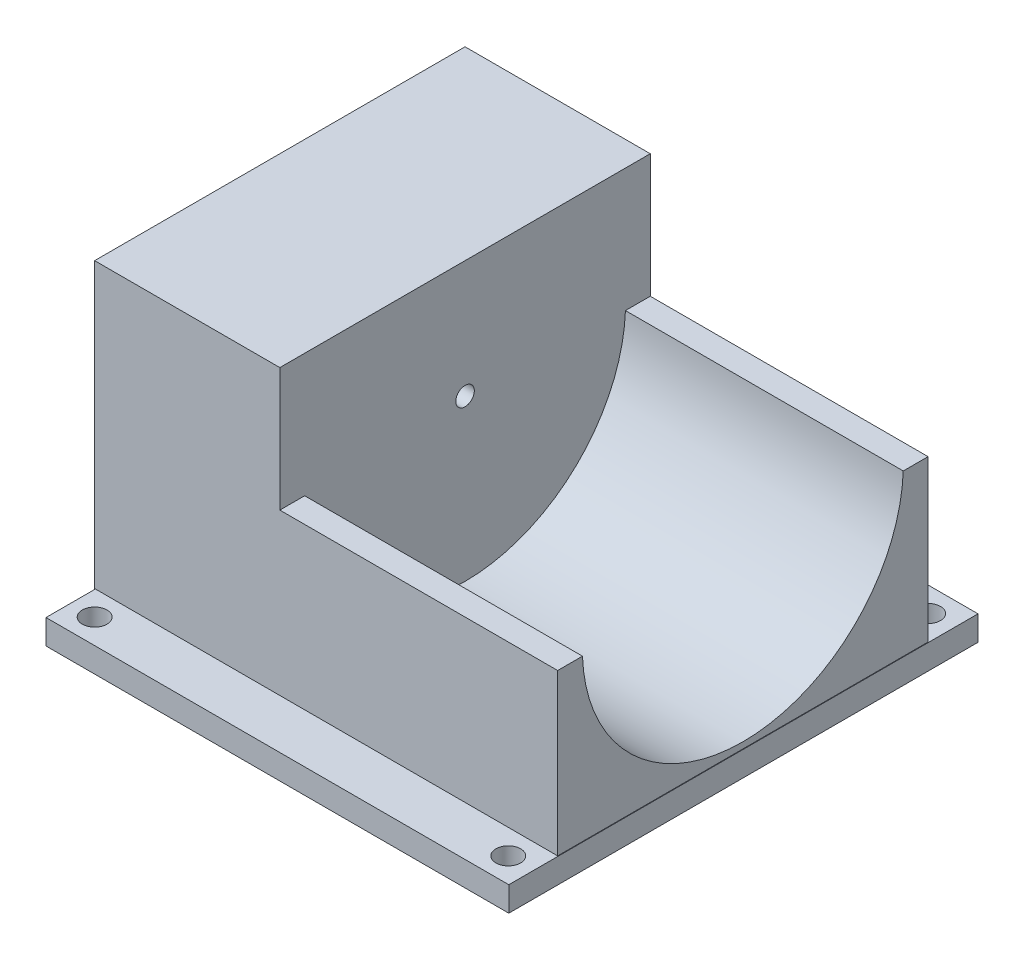
ISO-10303-21;
HEADER;
FILE_DESCRIPTION(('STEP AP214'),'2;1');
FILE_NAME('part.step','',(''),(''),'','','');
FILE_SCHEMA(('AUTOMOTIVE_DESIGN { 1 0 10303 214 1 1 1 1 }'));
ENDSEC;
DATA;
#1=APPLICATION_CONTEXT('core data for automotive mechanical design processes');
#2=APPLICATION_PROTOCOL_DEFINITION('international standard','automotive_design',2000,#1);
#3=PRODUCT_CONTEXT('',#1,'mechanical');
#4=PRODUCT('Part','Part','',(#3));
#5=PRODUCT_RELATED_PRODUCT_CATEGORY('part','',(#4));
#6=PRODUCT_DEFINITION_FORMATION('','',#4);
#7=PRODUCT_DEFINITION_CONTEXT('part definition',#1,'design');
#8=PRODUCT_DEFINITION('design','',#6,#7);
#9=PRODUCT_DEFINITION_SHAPE('','',#8);
#10=(LENGTH_UNIT() NAMED_UNIT(*) SI_UNIT(.MILLI.,.METRE.));
#11=(NAMED_UNIT(*) PLANE_ANGLE_UNIT() SI_UNIT($,.RADIAN.));
#12=(NAMED_UNIT(*) SI_UNIT($,.STERADIAN.) SOLID_ANGLE_UNIT());
#13=UNCERTAINTY_MEASURE_WITH_UNIT(LENGTH_MEASURE(1.E-05),#10,'distance_accuracy_value','');
#14=(GEOMETRIC_REPRESENTATION_CONTEXT(3) GLOBAL_UNCERTAINTY_ASSIGNED_CONTEXT((#13)) GLOBAL_UNIT_ASSIGNED_CONTEXT((#10,
#11,#12)) REPRESENTATION_CONTEXT('',''));
#15=CARTESIAN_POINT('',(0.,0.,0.));
#16=DIRECTION('',(0.,0.,1.));
#17=DIRECTION('',(1.,0.,0.));
#18=AXIS2_PLACEMENT_3D('',#15,#16,#17);
#19=CARTESIAN_POINT('',(60.,31.,0.));
#20=DIRECTION('',(1.,0.,0.));
#21=DIRECTION('',(0.,0.,-1.));
#22=AXIS2_PLACEMENT_3D('',#19,#20,#21);
#23=PLANE('',#22);
#24=DIRECTION('',(0.,-1.,0.));
#25=VECTOR('',#24,1.);
#26=CARTESIAN_POINT('',(60.,30.0067820848976,30.));
#27=LINE('',#26,#25);
#28=CARTESIAN_POINT('',(60.,30.0067820848976,30.));
#29=VERTEX_POINT('',#28);
#30=CARTESIAN_POINT('',(60.,4.00000000000001,30.));
#31=VERTEX_POINT('',#30);
#32=EDGE_CURVE('E234',#29,#31,#27,.T.);
#33=ORIENTED_EDGE('',*,*,#32,.T.);
#34=DIRECTION('',(0.,0.,-1.));
#35=VECTOR('',#34,1.);
#36=CARTESIAN_POINT('',(60.,4.,0.));
#37=LINE('',#36,#35);
#38=CARTESIAN_POINT('',(60.,4.,-30.));
#39=VERTEX_POINT('',#38);
#40=EDGE_CURVE('E12',#31,#39,#37,.T.);
#41=ORIENTED_EDGE('',*,*,#40,.T.);
#42=DIRECTION('',(0.,1.,0.));
#43=VECTOR('',#42,1.);
#44=CARTESIAN_POINT('',(60.,0.,-30.));
#45=LINE('',#44,#43);
#46=CARTESIAN_POINT('',(60.,30.0067820848976,-30.));
#47=VERTEX_POINT('',#46);
#48=EDGE_CURVE('E238',#39,#47,#45,.T.);
#49=ORIENTED_EDGE('',*,*,#48,.T.);
#50=DIRECTION('',(0.,0.,1.));
#51=VECTOR('',#50,1.);
#52=CARTESIAN_POINT('',(60.,30.0067820848976,-30.));
#53=LINE('',#52,#51);
#54=CARTESIAN_POINT('',(60.,30.0067820848976,-25.9810222695936));
#55=VERTEX_POINT('',#54);
#56=EDGE_CURVE('E241',#47,#55,#53,.T.);
#57=ORIENTED_EDGE('',*,*,#56,.T.);
#58=CARTESIAN_POINT('',(60.,31.,0.));
#59=DIRECTION('',(-1.,0.,0.));
#60=DIRECTION('',(0.,0.,-1.));
#61=AXIS2_PLACEMENT_3D('',#58,#59,#60);
#62=CIRCLE('',#61,26.);
#63=CARTESIAN_POINT('',(60.,30.0067820848976,25.9810222695936));
#64=VERTEX_POINT('',#63);
#65=EDGE_CURVE('E226',#55,#64,#62,.T.);
#66=ORIENTED_EDGE('',*,*,#65,.T.);
#67=DIRECTION('',(0.,0.,1.));
#68=VECTOR('',#67,1.);
#69=CARTESIAN_POINT('',(60.,30.0067820848976,25.9810222695936));
#70=LINE('',#69,#68);
#71=EDGE_CURVE('E230',#64,#29,#70,.T.);
#72=ORIENTED_EDGE('',*,*,#71,.T.);
#73=EDGE_LOOP('',(#33,#41,#49,#57,#66,#72));
#74=FACE_BOUND('',#73,.T.);
#75=ADVANCED_FACE('F52',(#74),#23,.T.);
#76=CARTESIAN_POINT('',(15.,50.,30.));
#77=DIRECTION('',(-1.,0.,0.));
#78=DIRECTION('',(0.,0.,1.));
#79=AXIS2_PLACEMENT_3D('',#76,#77,#78);
#80=PLANE('',#79);
#81=CARTESIAN_POINT('',(15.,31.,0.));
#82=DIRECTION('',(1.,0.,0.));
#83=DIRECTION('',(0.,0.,-1.));
#84=AXIS2_PLACEMENT_3D('',#81,#82,#83);
#85=CIRCLE('',#84,1.5);
#86=CARTESIAN_POINT('',(15.,31.,-1.5));
#87=VERTEX_POINT('',#86);
#88=EDGE_CURVE('E362',#87,#87,#85,.T.);
#89=ORIENTED_EDGE('',*,*,#88,.F.);
#90=EDGE_LOOP('',(#89));
#91=FACE_BOUND('',#90,.T.);
#92=DIRECTION('',(0.,0.,1.));
#93=VECTOR('',#92,1.);
#94=CARTESIAN_POINT('',(15.,30.0067820848976,-30.));
#95=LINE('',#94,#93);
#96=CARTESIAN_POINT('',(15.,30.0067820848976,-30.));
#97=VERTEX_POINT('',#96);
#98=CARTESIAN_POINT('',(15.,30.0067820848976,-25.9810222695936));
#99=VERTEX_POINT('',#98);
#100=EDGE_CURVE('E231',#97,#99,#95,.T.);
#101=ORIENTED_EDGE('',*,*,#100,.F.);
#102=DIRECTION('',(0.,-1.,0.));
#103=VECTOR('',#102,1.);
#104=CARTESIAN_POINT('',(15.,50.,-30.));
#105=LINE('',#104,#103);
#106=CARTESIAN_POINT('',(15.,50.,-30.));
#107=VERTEX_POINT('',#106);
#108=EDGE_CURVE('E297',#107,#97,#105,.T.);
#109=ORIENTED_EDGE('',*,*,#108,.F.);
#110=DIRECTION('',(0.,0.,-1.));
#111=VECTOR('',#110,1.);
#112=CARTESIAN_POINT('',(15.,50.,30.));
#113=LINE('',#112,#111);
#114=CARTESIAN_POINT('',(15.,50.,30.));
#115=VERTEX_POINT('',#114);
#116=EDGE_CURVE('E279',#115,#107,#113,.T.);
#117=ORIENTED_EDGE('',*,*,#116,.F.);
#118=DIRECTION('',(0.,-1.,0.));
#119=VECTOR('',#118,1.);
#120=CARTESIAN_POINT('',(15.,50.,30.));
#121=LINE('',#120,#119);
#122=CARTESIAN_POINT('',(15.,30.0067820848976,30.));
#123=VERTEX_POINT('',#122);
#124=EDGE_CURVE('E301',#115,#123,#121,.T.);
#125=ORIENTED_EDGE('',*,*,#124,.T.);
#126=DIRECTION('',(0.,0.,1.));
#127=VECTOR('',#126,1.);
#128=CARTESIAN_POINT('',(15.,30.0067820848976,25.9810222695936));
#129=LINE('',#128,#127);
#130=CARTESIAN_POINT('',(15.,30.0067820848976,25.9810222695936));
#131=VERTEX_POINT('',#130);
#132=EDGE_CURVE('E248',#131,#123,#129,.T.);
#133=ORIENTED_EDGE('',*,*,#132,.F.);
#134=CARTESIAN_POINT('',(15.,31.,0.));
#135=DIRECTION('',(-1.,0.,0.));
#136=DIRECTION('',(0.,0.,-1.));
#137=AXIS2_PLACEMENT_3D('',#134,#135,#136);
#138=CIRCLE('',#137,26.);
#139=EDGE_CURVE('E225',#99,#131,#138,.T.);
#140=ORIENTED_EDGE('',*,*,#139,.F.);
#141=EDGE_LOOP('',(#101,#109,#117,#125,#133,#140));
#142=FACE_BOUND('',#141,.T.);
#143=ADVANCED_FACE('F379',(#91,#142),#80,.F.);
#144=CARTESIAN_POINT('',(-15.,50.,30.));
#145=DIRECTION('',(1.,0.,0.));
#146=DIRECTION('',(0.,0.,-1.));
#147=AXIS2_PLACEMENT_3D('',#144,#145,#146);
#148=PLANE('',#147);
#149=DIRECTION('',(0.,0.,1.));
#150=VECTOR('',#149,1.);
#151=CARTESIAN_POINT('',(-15.,0.,30.));
#152=LINE('',#151,#150);
#153=CARTESIAN_POINT('',(-15.,0.,-30.));
#154=VERTEX_POINT('',#153);
#155=CARTESIAN_POINT('',(-15.,0.,30.));
#156=VERTEX_POINT('',#155);
#157=EDGE_CURVE('E270',#154,#156,#152,.T.);
#158=ORIENTED_EDGE('',*,*,#157,.T.);
#159=DIRECTION('',(0.,-1.,0.));
#160=VECTOR('',#159,1.);
#161=CARTESIAN_POINT('',(-15.,50.,30.));
#162=LINE('',#161,#160);
#163=CARTESIAN_POINT('',(-15.,50.,30.));
#164=VERTEX_POINT('',#163);
#165=EDGE_CURVE('E61',#164,#156,#162,.T.);
#166=ORIENTED_EDGE('',*,*,#165,.F.);
#167=DIRECTION('',(0.,0.,1.));
#168=VECTOR('',#167,1.);
#169=CARTESIAN_POINT('',(-15.,50.,30.));
#170=LINE('',#169,#168);
#171=CARTESIAN_POINT('',(-15.,50.,-30.));
#172=VERTEX_POINT('',#171);
#173=EDGE_CURVE('E271',#172,#164,#170,.T.);
#174=ORIENTED_EDGE('',*,*,#173,.F.);
#175=DIRECTION('',(0.,-1.,0.));
#176=VECTOR('',#175,1.);
#177=CARTESIAN_POINT('',(-15.,50.,-30.));
#178=LINE('',#177,#176);
#179=EDGE_CURVE('E285',#172,#154,#178,.T.);
#180=ORIENTED_EDGE('',*,*,#179,.T.);
#181=EDGE_LOOP('',(#158,#166,#174,#180));
#182=FACE_BOUND('',#181,.T.);
#183=ADVANCED_FACE('F54',(#182),#148,.F.);
#184=CARTESIAN_POINT('',(15.,50.,30.));
#185=DIRECTION('',(0.,0.,-1.));
#186=DIRECTION('',(-1.,0.,0.));
#187=AXIS2_PLACEMENT_3D('',#184,#185,#186);
#188=PLANE('',#187);
#189=DIRECTION('',(1.,0.,0.));
#190=VECTOR('',#189,1.);
#191=CARTESIAN_POINT('',(15.,0.,30.));
#192=LINE('',#191,#190);
#193=CARTESIAN_POINT('',(-14.8775471331955,0.,30.));
#194=VERTEX_POINT('',#193);
#195=EDGE_CURVE('E289',#156,#194,#192,.T.);
#196=ORIENTED_EDGE('',*,*,#195,.T.);
#197=DIRECTION('',(0.,1.,0.));
#198=VECTOR('',#197,1.);
#199=CARTESIAN_POINT('',(-14.8775471331955,50.,30.));
#200=LINE('',#199,#198);
#201=CARTESIAN_POINT('',(-14.8775471331955,4.,30.));
#202=VERTEX_POINT('',#201);
#203=EDGE_CURVE('E68',#194,#202,#200,.T.);
#204=ORIENTED_EDGE('',*,*,#203,.T.);
#205=DIRECTION('',(-1.,0.,0.));
#206=VECTOR('',#205,1.);
#207=CARTESIAN_POINT('',(15.,4.,30.));
#208=LINE('',#207,#206);
#209=EDGE_CURVE('E218',#31,#202,#208,.T.);
#210=ORIENTED_EDGE('',*,*,#209,.F.);
#211=ORIENTED_EDGE('',*,*,#32,.F.);
#212=DIRECTION('',(-1.,0.,0.));
#213=VECTOR('',#212,1.);
#214=CARTESIAN_POINT('',(60.,30.0067820848976,30.));
#215=LINE('',#214,#213);
#216=EDGE_CURVE('E262',#29,#123,#215,.T.);
#217=ORIENTED_EDGE('',*,*,#216,.T.);
#218=ORIENTED_EDGE('',*,*,#124,.F.);
#219=DIRECTION('',(1.,0.,0.));
#220=VECTOR('',#219,1.);
#221=CARTESIAN_POINT('',(15.,50.,30.));
#222=LINE('',#221,#220);
#223=EDGE_CURVE('E275',#164,#115,#222,.T.);
#224=ORIENTED_EDGE('',*,*,#223,.F.);
#225=ORIENTED_EDGE('',*,*,#165,.T.);
#226=EDGE_LOOP('',(#196,#204,#210,#211,#217,#218,#224,#225));
#227=FACE_BOUND('',#226,.T.);
#228=ADVANCED_FACE('F306',(#227),#188,.F.);
#229=CARTESIAN_POINT('',(15.,50.,-30.));
#230=DIRECTION('',(0.,0.,1.));
#231=DIRECTION('',(1.,0.,0.));
#232=AXIS2_PLACEMENT_3D('',#229,#230,#231);
#233=PLANE('',#232);
#234=DIRECTION('',(1.,0.,0.));
#235=VECTOR('',#234,1.);
#236=CARTESIAN_POINT('',(15.,4.,-30.));
#237=LINE('',#236,#235);
#238=CARTESIAN_POINT('',(-14.8775471331955,4.,-30.));
#239=VERTEX_POINT('',#238);
#240=EDGE_CURVE('E76',#239,#39,#237,.T.);
#241=ORIENTED_EDGE('',*,*,#240,.F.);
#242=DIRECTION('',(0.,-1.,0.));
#243=VECTOR('',#242,1.);
#244=CARTESIAN_POINT('',(-14.8775471331955,50.,-30.));
#245=LINE('',#244,#243);
#246=CARTESIAN_POINT('',(-14.8775471331955,0.,-30.));
#247=VERTEX_POINT('',#246);
#248=EDGE_CURVE('E160',#239,#247,#245,.T.);
#249=ORIENTED_EDGE('',*,*,#248,.T.);
#250=DIRECTION('',(-1.,0.,0.));
#251=VECTOR('',#250,1.);
#252=CARTESIAN_POINT('',(15.,0.,-30.));
#253=LINE('',#252,#251);
#254=EDGE_CURVE('E276',#247,#154,#253,.T.);
#255=ORIENTED_EDGE('',*,*,#254,.T.);
#256=ORIENTED_EDGE('',*,*,#179,.F.);
#257=DIRECTION('',(-1.,0.,0.));
#258=VECTOR('',#257,1.);
#259=CARTESIAN_POINT('',(15.,50.,-30.));
#260=LINE('',#259,#258);
#261=EDGE_CURVE('E282',#107,#172,#260,.T.);
#262=ORIENTED_EDGE('',*,*,#261,.F.);
#263=ORIENTED_EDGE('',*,*,#108,.T.);
#264=DIRECTION('',(-1.,0.,0.));
#265=VECTOR('',#264,1.);
#266=CARTESIAN_POINT('',(60.,30.0067820848976,-30.));
#267=LINE('',#266,#265);
#268=EDGE_CURVE('E258',#47,#97,#267,.T.);
#269=ORIENTED_EDGE('',*,*,#268,.F.);
#270=ORIENTED_EDGE('',*,*,#48,.F.);
#271=EDGE_LOOP('',(#241,#249,#255,#256,#262,#263,#269,#270));
#272=FACE_BOUND('',#271,.T.);
#273=ADVANCED_FACE('F389',(#272),#233,.F.);
#274=CARTESIAN_POINT('',(0.,50.,0.));
#275=DIRECTION('',(0.,1.,0.));
#276=DIRECTION('',(0.,0.,1.));
#277=AXIS2_PLACEMENT_3D('',#274,#275,#276);
#278=PLANE('',#277);
#279=ORIENTED_EDGE('',*,*,#173,.T.);
#280=ORIENTED_EDGE('',*,*,#223,.T.);
#281=ORIENTED_EDGE('',*,*,#116,.T.);
#282=ORIENTED_EDGE('',*,*,#261,.T.);
#283=EDGE_LOOP('',(#279,#280,#281,#282));
#284=FACE_BOUND('',#283,.T.);
#285=ADVANCED_FACE('F400',(#284),#278,.T.);
#286=CARTESIAN_POINT('',(0.,0.,0.));
#287=DIRECTION('',(0.,1.,0.));
#288=DIRECTION('',(0.,0.,1.));
#289=AXIS2_PLACEMENT_3D('',#286,#287,#288);
#290=PLANE('',#289);
#291=DIRECTION('',(0.,0.,-1.));
#292=VECTOR('',#291,1.);
#293=CARTESIAN_POINT('',(-14.8775471331955,0.,38.));
#294=LINE('',#293,#292);
#295=CARTESIAN_POINT('',(-14.8775471331955,0.,38.));
#296=VERTEX_POINT('',#295);
#297=EDGE_CURVE('E194',#296,#194,#294,.T.);
#298=ORIENTED_EDGE('',*,*,#297,.T.);
#299=ORIENTED_EDGE('',*,*,#195,.F.);
#300=ORIENTED_EDGE('',*,*,#157,.F.);
#301=ORIENTED_EDGE('',*,*,#254,.F.);
#302=CARTESIAN_POINT('',(-14.8775471331955,0.,-38.));
#303=VERTEX_POINT('',#302);
#304=EDGE_CURVE('E198',#247,#303,#294,.T.);
#305=ORIENTED_EDGE('',*,*,#304,.T.);
#306=DIRECTION('',(1.,0.,0.));
#307=VECTOR('',#306,1.);
#308=CARTESIAN_POINT('',(-14.8775471331955,0.,-38.));
#309=LINE('',#308,#307);
#310=CARTESIAN_POINT('',(60.0862314558118,0.,-38.));
#311=VERTEX_POINT('',#310);
#312=EDGE_CURVE('E172',#303,#311,#309,.T.);
#313=ORIENTED_EDGE('',*,*,#312,.T.);
#314=DIRECTION('',(0.,0.,1.));
#315=VECTOR('',#314,1.);
#316=CARTESIAN_POINT('',(60.0862314558117,0.,38.));
#317=LINE('',#316,#315);
#318=CARTESIAN_POINT('',(60.0862314558117,0.,38.));
#319=VERTEX_POINT('',#318);
#320=EDGE_CURVE('E201',#311,#319,#317,.T.);
#321=ORIENTED_EDGE('',*,*,#320,.T.);
#322=DIRECTION('',(-1.,0.,0.));
#323=VECTOR('',#322,1.);
#324=CARTESIAN_POINT('',(-14.8775471331955,0.,38.));
#325=LINE('',#324,#323);
#326=EDGE_CURVE('E165',#319,#296,#325,.T.);
#327=ORIENTED_EDGE('',*,*,#326,.T.);
#328=EDGE_LOOP('',(#298,#299,#300,#301,#305,#313,#321,#327));
#329=FACE_BOUND('',#328,.T.);
#330=CARTESIAN_POINT('',(-11.,0.,34.));
#331=DIRECTION('',(0.,-1.,0.));
#332=DIRECTION('',(0.,0.,-1.));
#333=AXIS2_PLACEMENT_3D('',#330,#331,#332);
#334=CIRCLE('',#333,2.);
#335=CARTESIAN_POINT('',(-11.,0.,32.));
#336=VERTEX_POINT('',#335);
#337=EDGE_CURVE('E330',#336,#336,#334,.T.);
#338=ORIENTED_EDGE('',*,*,#337,.F.);
#339=EDGE_LOOP('',(#338));
#340=FACE_BOUND('',#339,.T.);
#341=CARTESIAN_POINT('',(56.,0.,34.));
#342=DIRECTION('',(0.,-1.,0.));
#343=DIRECTION('',(0.,0.,-1.));
#344=AXIS2_PLACEMENT_3D('',#341,#342,#343);
#345=CIRCLE('',#344,2.);
#346=CARTESIAN_POINT('',(56.,0.,32.));
#347=VERTEX_POINT('',#346);
#348=EDGE_CURVE('E338',#347,#347,#345,.T.);
#349=ORIENTED_EDGE('',*,*,#348,.F.);
#350=EDGE_LOOP('',(#349));
#351=FACE_BOUND('',#350,.T.);
#352=CARTESIAN_POINT('',(56.,0.,-34.));
#353=DIRECTION('',(0.,-1.,0.));
#354=DIRECTION('',(0.,0.,-1.));
#355=AXIS2_PLACEMENT_3D('',#352,#353,#354);
#356=CIRCLE('',#355,2.);
#357=CARTESIAN_POINT('',(56.,0.,-36.));
#358=VERTEX_POINT('',#357);
#359=EDGE_CURVE('E346',#358,#358,#356,.T.);
#360=ORIENTED_EDGE('',*,*,#359,.F.);
#361=EDGE_LOOP('',(#360));
#362=FACE_BOUND('',#361,.T.);
#363=CARTESIAN_POINT('',(-11.,0.,-34.));
#364=DIRECTION('',(0.,-1.,0.));
#365=DIRECTION('',(0.,0.,-1.));
#366=AXIS2_PLACEMENT_3D('',#363,#364,#365);
#367=CIRCLE('',#366,2.);
#368=CARTESIAN_POINT('',(-11.,0.,-36.));
#369=VERTEX_POINT('',#368);
#370=EDGE_CURVE('E354',#369,#369,#367,.T.);
#371=ORIENTED_EDGE('',*,*,#370,.F.);
#372=EDGE_LOOP('',(#371));
#373=FACE_BOUND('',#372,.T.);
#374=ADVANCED_FACE('F314',(#329,#340,#351,#362,#373),#290,.F.);
#375=CARTESIAN_POINT('',(60.,31.,0.));
#376=DIRECTION('',(-1.,0.,0.));
#377=DIRECTION('',(0.,0.,1.));
#378=AXIS2_PLACEMENT_3D('',#375,#376,#377);
#379=CYLINDRICAL_SURFACE('',#378,26.);
#380=ORIENTED_EDGE('',*,*,#139,.T.);
#381=DIRECTION('',(-1.,0.,0.));
#382=VECTOR('',#381,1.);
#383=CARTESIAN_POINT('',(60.,30.0067820848976,25.9810222695936));
#384=LINE('',#383,#382);
#385=EDGE_CURVE('E266',#64,#131,#384,.T.);
#386=ORIENTED_EDGE('',*,*,#385,.F.);
#387=ORIENTED_EDGE('',*,*,#65,.F.);
#388=DIRECTION('',(-1.,0.,0.));
#389=VECTOR('',#388,1.);
#390=CARTESIAN_POINT('',(60.,30.0067820848976,-25.9810222695936));
#391=LINE('',#390,#389);
#392=EDGE_CURVE('E244',#55,#99,#391,.T.);
#393=ORIENTED_EDGE('',*,*,#392,.T.);
#394=EDGE_LOOP('',(#380,#386,#387,#393));
#395=FACE_BOUND('',#394,.T.);
#396=ADVANCED_FACE('F407',(#395),#379,.F.);
#397=CARTESIAN_POINT('',(60.,30.0067820848976,25.9810222695936));
#398=DIRECTION('',(0.,-1.,0.));
#399=DIRECTION('',(0.,0.,-1.));
#400=AXIS2_PLACEMENT_3D('',#397,#398,#399);
#401=PLANE('',#400);
#402=ORIENTED_EDGE('',*,*,#132,.T.);
#403=ORIENTED_EDGE('',*,*,#216,.F.);
#404=ORIENTED_EDGE('',*,*,#71,.F.);
#405=ORIENTED_EDGE('',*,*,#385,.T.);
#406=EDGE_LOOP('',(#402,#403,#404,#405));
#407=FACE_BOUND('',#406,.T.);
#408=ADVANCED_FACE('F398',(#407),#401,.F.);
#409=CARTESIAN_POINT('',(60.,30.0067820848976,-30.));
#410=DIRECTION('',(0.,-1.,0.));
#411=DIRECTION('',(0.,0.,-1.));
#412=AXIS2_PLACEMENT_3D('',#409,#410,#411);
#413=PLANE('',#412);
#414=ORIENTED_EDGE('',*,*,#100,.T.);
#415=ORIENTED_EDGE('',*,*,#392,.F.);
#416=ORIENTED_EDGE('',*,*,#56,.F.);
#417=ORIENTED_EDGE('',*,*,#268,.T.);
#418=EDGE_LOOP('',(#414,#415,#416,#417));
#419=FACE_BOUND('',#418,.T.);
#420=ADVANCED_FACE('F391',(#419),#413,.F.);
#421=CARTESIAN_POINT('',(-14.8775471331955,4.,38.));
#422=DIRECTION('',(-1.,0.,0.));
#423=DIRECTION('',(0.,0.,1.));
#424=AXIS2_PLACEMENT_3D('',#421,#422,#423);
#425=PLANE('',#424);
#426=ORIENTED_EDGE('',*,*,#203,.F.);
#427=ORIENTED_EDGE('',*,*,#297,.F.);
#428=DIRECTION('',(0.,-1.,0.));
#429=VECTOR('',#428,1.);
#430=CARTESIAN_POINT('',(-14.8775471331955,4.,38.));
#431=LINE('',#430,#429);
#432=CARTESIAN_POINT('',(-14.8775471331955,4.,38.));
#433=VERTEX_POINT('',#432);
#434=EDGE_CURVE('E208',#433,#296,#431,.T.);
#435=ORIENTED_EDGE('',*,*,#434,.F.);
#436=DIRECTION('',(0.,0.,-1.));
#437=VECTOR('',#436,1.);
#438=CARTESIAN_POINT('',(-14.8775471331955,4.,38.));
#439=LINE('',#438,#437);
#440=EDGE_CURVE('E164',#433,#202,#439,.T.);
#441=ORIENTED_EDGE('',*,*,#440,.T.);
#442=EDGE_LOOP('',(#426,#427,#435,#441));
#443=FACE_BOUND('',#442,.T.);
#444=ADVANCED_FACE('F319',(#443),#425,.T.);
#445=ORIENTED_EDGE('',*,*,#248,.F.);
#446=CARTESIAN_POINT('',(-14.8775471331955,4.,-38.));
#447=VERTEX_POINT('',#446);
#448=EDGE_CURVE('E154',#239,#447,#439,.T.);
#449=ORIENTED_EDGE('',*,*,#448,.T.);
#450=DIRECTION('',(0.,-1.,0.));
#451=VECTOR('',#450,1.);
#452=CARTESIAN_POINT('',(-14.8775471331955,4.,-38.));
#453=LINE('',#452,#451);
#454=EDGE_CURVE('E158',#447,#303,#453,.T.);
#455=ORIENTED_EDGE('',*,*,#454,.T.);
#456=ORIENTED_EDGE('',*,*,#304,.F.);
#457=EDGE_LOOP('',(#445,#449,#455,#456));
#458=FACE_BOUND('',#457,.T.);
#459=ADVANCED_FACE('F156',(#458),#425,.T.);
#460=CARTESIAN_POINT('',(0.,4.,0.));
#461=DIRECTION('',(0.,-1.,0.));
#462=DIRECTION('',(0.,0.,-1.));
#463=AXIS2_PLACEMENT_3D('',#460,#461,#462);
#464=PLANE('',#463);
#465=CARTESIAN_POINT('',(-11.,4.,-34.));
#466=DIRECTION('',(0.,-1.,0.));
#467=DIRECTION('',(0.,0.,-1.));
#468=AXIS2_PLACEMENT_3D('',#465,#466,#467);
#469=CIRCLE('',#468,2.);
#470=CARTESIAN_POINT('',(-11.,4.,-36.));
#471=VERTEX_POINT('',#470);
#472=EDGE_CURVE('E350',#471,#471,#469,.T.);
#473=ORIENTED_EDGE('',*,*,#472,.T.);
#474=EDGE_LOOP('',(#473));
#475=FACE_BOUND('',#474,.T.);
#476=CARTESIAN_POINT('',(56.,4.,-34.));
#477=DIRECTION('',(0.,-1.,0.));
#478=DIRECTION('',(0.,0.,-1.));
#479=AXIS2_PLACEMENT_3D('',#476,#477,#478);
#480=CIRCLE('',#479,2.);
#481=CARTESIAN_POINT('',(56.,4.,-36.));
#482=VERTEX_POINT('',#481);
#483=EDGE_CURVE('E342',#482,#482,#480,.T.);
#484=ORIENTED_EDGE('',*,*,#483,.T.);
#485=EDGE_LOOP('',(#484));
#486=FACE_BOUND('',#485,.T.);
#487=CARTESIAN_POINT('',(56.,4.,34.));
#488=DIRECTION('',(0.,-1.,0.));
#489=DIRECTION('',(0.,0.,-1.));
#490=AXIS2_PLACEMENT_3D('',#487,#488,#489);
#491=CIRCLE('',#490,2.);
#492=CARTESIAN_POINT('',(56.,4.,32.));
#493=VERTEX_POINT('',#492);
#494=EDGE_CURVE('E336',#493,#493,#491,.T.);
#495=ORIENTED_EDGE('',*,*,#494,.T.);
#496=EDGE_LOOP('',(#495));
#497=FACE_BOUND('',#496,.T.);
#498=CARTESIAN_POINT('',(-11.,4.,34.));
#499=DIRECTION('',(0.,-1.,0.));
#500=DIRECTION('',(0.,0.,-1.));
#501=AXIS2_PLACEMENT_3D('',#498,#499,#500);
#502=CIRCLE('',#501,2.);
#503=CARTESIAN_POINT('',(-11.,4.,32.));
#504=VERTEX_POINT('',#503);
#505=EDGE_CURVE('E327',#504,#504,#502,.T.);
#506=ORIENTED_EDGE('',*,*,#505,.T.);
#507=EDGE_LOOP('',(#506));
#508=FACE_BOUND('',#507,.T.);
#509=ORIENTED_EDGE('',*,*,#40,.F.);
#510=ORIENTED_EDGE('',*,*,#209,.T.);
#511=ORIENTED_EDGE('',*,*,#440,.F.);
#512=DIRECTION('',(-1.,0.,0.));
#513=VECTOR('',#512,1.);
#514=CARTESIAN_POINT('',(-14.8775471331955,4.,38.));
#515=LINE('',#514,#513);
#516=CARTESIAN_POINT('',(60.0862314558117,4.,38.));
#517=VERTEX_POINT('',#516);
#518=EDGE_CURVE('E175',#517,#433,#515,.T.);
#519=ORIENTED_EDGE('',*,*,#518,.F.);
#520=DIRECTION('',(0.,0.,1.));
#521=VECTOR('',#520,1.);
#522=CARTESIAN_POINT('',(60.0862314558117,4.,38.));
#523=LINE('',#522,#521);
#524=CARTESIAN_POINT('',(60.0862314558118,4.,-38.));
#525=VERTEX_POINT('',#524);
#526=EDGE_CURVE('E182',#525,#517,#523,.T.);
#527=ORIENTED_EDGE('',*,*,#526,.F.);
#528=DIRECTION('',(1.,0.,0.));
#529=VECTOR('',#528,1.);
#530=CARTESIAN_POINT('',(-14.8775471331955,4.,-38.));
#531=LINE('',#530,#529);
#532=EDGE_CURVE('E170',#447,#525,#531,.T.);
#533=ORIENTED_EDGE('',*,*,#532,.F.);
#534=ORIENTED_EDGE('',*,*,#448,.F.);
#535=ORIENTED_EDGE('',*,*,#240,.T.);
#536=EDGE_LOOP('',(#509,#510,#511,#519,#527,#533,#534,#535));
#537=FACE_BOUND('',#536,.T.);
#538=ADVANCED_FACE('F179',(#475,#486,#497,#508,#537),#464,.F.);
#539=CARTESIAN_POINT('',(-14.8775471331955,4.,38.));
#540=DIRECTION('',(0.,0.,1.));
#541=DIRECTION('',(1.,0.,0.));
#542=AXIS2_PLACEMENT_3D('',#539,#540,#541);
#543=PLANE('',#542);
#544=ORIENTED_EDGE('',*,*,#326,.F.);
#545=DIRECTION('',(0.,-1.,0.));
#546=VECTOR('',#545,1.);
#547=CARTESIAN_POINT('',(60.0862314558117,4.,38.));
#548=LINE('',#547,#546);
#549=EDGE_CURVE('E211',#517,#319,#548,.T.);
#550=ORIENTED_EDGE('',*,*,#549,.F.);
#551=ORIENTED_EDGE('',*,*,#518,.T.);
#552=ORIENTED_EDGE('',*,*,#434,.T.);
#553=EDGE_LOOP('',(#544,#550,#551,#552));
#554=FACE_BOUND('',#553,.T.);
#555=ADVANCED_FACE('F322',(#554),#543,.T.);
#556=CARTESIAN_POINT('',(60.0862314558117,4.,38.));
#557=DIRECTION('',(1.,0.,0.));
#558=DIRECTION('',(0.,0.,-1.));
#559=AXIS2_PLACEMENT_3D('',#556,#557,#558);
#560=PLANE('',#559);
#561=ORIENTED_EDGE('',*,*,#320,.F.);
#562=DIRECTION('',(0.,-1.,0.));
#563=VECTOR('',#562,1.);
#564=CARTESIAN_POINT('',(60.0862314558118,4.,-38.));
#565=LINE('',#564,#563);
#566=EDGE_CURVE('E174',#525,#311,#565,.T.);
#567=ORIENTED_EDGE('',*,*,#566,.F.);
#568=ORIENTED_EDGE('',*,*,#526,.T.);
#569=ORIENTED_EDGE('',*,*,#549,.T.);
#570=EDGE_LOOP('',(#561,#567,#568,#569));
#571=FACE_BOUND('',#570,.T.);
#572=ADVANCED_FACE('F325',(#571),#560,.T.);
#573=CARTESIAN_POINT('',(-14.8775471331955,4.,-38.));
#574=DIRECTION('',(0.,0.,-1.));
#575=DIRECTION('',(-1.,0.,0.));
#576=AXIS2_PLACEMENT_3D('',#573,#574,#575);
#577=PLANE('',#576);
#578=ORIENTED_EDGE('',*,*,#312,.F.);
#579=ORIENTED_EDGE('',*,*,#454,.F.);
#580=ORIENTED_EDGE('',*,*,#532,.T.);
#581=ORIENTED_EDGE('',*,*,#566,.T.);
#582=EDGE_LOOP('',(#578,#579,#580,#581));
#583=FACE_BOUND('',#582,.T.);
#584=ADVANCED_FACE('F169',(#583),#577,.T.);
#585=CARTESIAN_POINT('',(-11.,4.,34.));
#586=DIRECTION('',(0.,-1.,0.));
#587=DIRECTION('',(0.,0.,-1.));
#588=AXIS2_PLACEMENT_3D('',#585,#586,#587);
#589=CYLINDRICAL_SURFACE('',#588,2.);
#590=ORIENTED_EDGE('',*,*,#505,.F.);
#591=EDGE_LOOP('',(#590));
#592=FACE_BOUND('',#591,.T.);
#593=ORIENTED_EDGE('',*,*,#337,.T.);
#594=EDGE_LOOP('',(#593));
#595=FACE_BOUND('',#594,.T.);
#596=ADVANCED_FACE('F471',(#592,#595),#589,.F.);
#597=CARTESIAN_POINT('',(56.,4.,34.));
#598=DIRECTION('',(0.,-1.,0.));
#599=DIRECTION('',(0.,0.,-1.));
#600=AXIS2_PLACEMENT_3D('',#597,#598,#599);
#601=CYLINDRICAL_SURFACE('',#600,2.);
#602=ORIENTED_EDGE('',*,*,#494,.F.);
#603=EDGE_LOOP('',(#602));
#604=FACE_BOUND('',#603,.T.);
#605=ORIENTED_EDGE('',*,*,#348,.T.);
#606=EDGE_LOOP('',(#605));
#607=FACE_BOUND('',#606,.T.);
#608=ADVANCED_FACE('F477',(#604,#607),#601,.F.);
#609=CARTESIAN_POINT('',(56.,4.,-34.));
#610=DIRECTION('',(0.,-1.,0.));
#611=DIRECTION('',(0.,0.,-1.));
#612=AXIS2_PLACEMENT_3D('',#609,#610,#611);
#613=CYLINDRICAL_SURFACE('',#612,2.);
#614=ORIENTED_EDGE('',*,*,#483,.F.);
#615=EDGE_LOOP('',(#614));
#616=FACE_BOUND('',#615,.T.);
#617=ORIENTED_EDGE('',*,*,#359,.T.);
#618=EDGE_LOOP('',(#617));
#619=FACE_BOUND('',#618,.T.);
#620=ADVANCED_FACE('F485',(#616,#619),#613,.F.);
#621=CARTESIAN_POINT('',(-11.,4.,-34.));
#622=DIRECTION('',(0.,-1.,0.));
#623=DIRECTION('',(0.,0.,-1.));
#624=AXIS2_PLACEMENT_3D('',#621,#622,#623);
#625=CYLINDRICAL_SURFACE('',#624,2.);
#626=ORIENTED_EDGE('',*,*,#472,.F.);
#627=EDGE_LOOP('',(#626));
#628=FACE_BOUND('',#627,.T.);
#629=ORIENTED_EDGE('',*,*,#370,.T.);
#630=EDGE_LOOP('',(#629));
#631=FACE_BOUND('',#630,.T.);
#632=ADVANCED_FACE('F375',(#628,#631),#625,.F.);
#633=CARTESIAN_POINT('',(9.99999999999999,31.,0.));
#634=DIRECTION('',(1.,0.,0.));
#635=DIRECTION('',(0.,0.,-1.));
#636=AXIS2_PLACEMENT_3D('',#633,#634,#635);
#637=CYLINDRICAL_SURFACE('',#636,1.5);
#638=CARTESIAN_POINT('',(9.99999999999999,31.,0.));
#639=DIRECTION('',(1.,0.,0.));
#640=DIRECTION('',(0.,0.,-1.));
#641=AXIS2_PLACEMENT_3D('',#638,#639,#640);
#642=CIRCLE('',#641,1.5);
#643=CARTESIAN_POINT('',(9.99999999999999,31.,-1.5));
#644=VERTEX_POINT('',#643);
#645=EDGE_CURVE('E358',#644,#644,#642,.T.);
#646=ORIENTED_EDGE('',*,*,#645,.F.);
#647=EDGE_LOOP('',(#646));
#648=FACE_BOUND('',#647,.T.);
#649=ORIENTED_EDGE('',*,*,#88,.T.);
#650=EDGE_LOOP('',(#649));
#651=FACE_BOUND('',#650,.T.);
#652=ADVANCED_FACE('F372',(#648,#651),#637,.F.);
#653=CARTESIAN_POINT('',(9.99999999999999,31.,0.));
#654=DIRECTION('',(1.,0.,0.));
#655=DIRECTION('',(0.,0.,-1.));
#656=AXIS2_PLACEMENT_3D('',#653,#654,#655);
#657=PLANE('',#656);
#658=ORIENTED_EDGE('',*,*,#645,.T.);
#659=EDGE_LOOP('',(#658));
#660=FACE_BOUND('',#659,.T.);
#661=ADVANCED_FACE('F370',(#660),#657,.T.);
#662=CLOSED_SHELL('',(#75,#143,#183,#228,#273,#285,#374,#396,#408,#420,#444,#459,#538,#555,#572,
#584,#596,#608,#620,#632,#652,#661));
#663=MANIFOLD_SOLID_BREP('B2',#662);
#664=ADVANCED_BREP_SHAPE_REPRESENTATION('',(#18,#663),#14);
#665=SHAPE_DEFINITION_REPRESENTATION(#9,#664);
ENDSEC;
END-ISO-10303-21;
